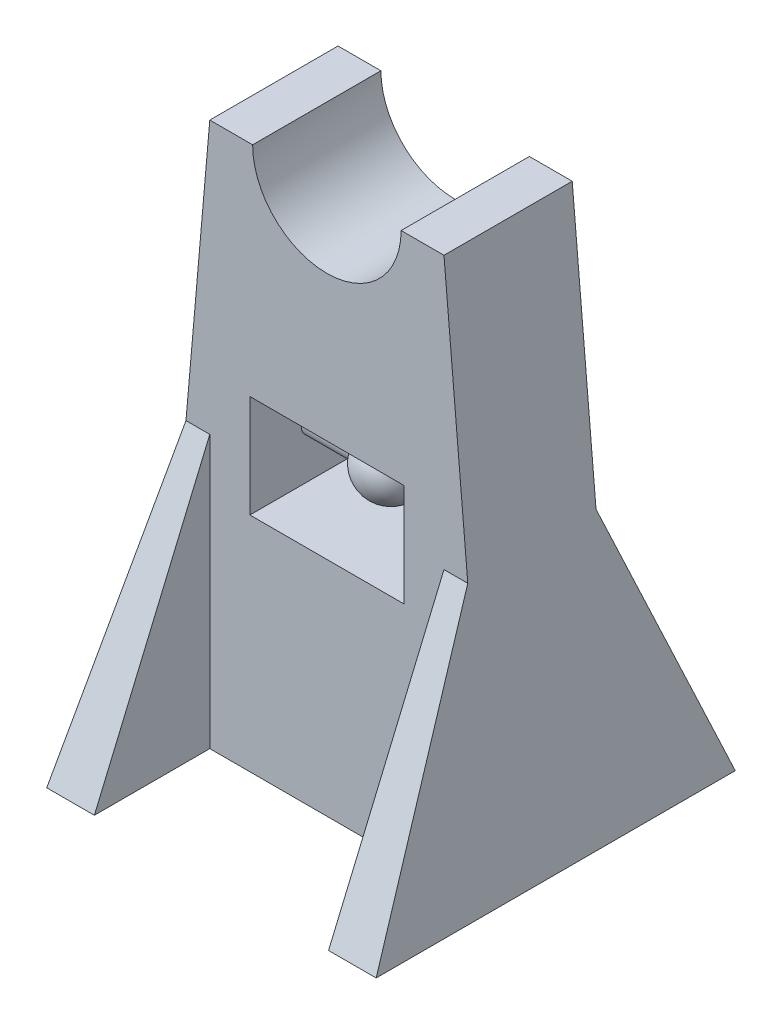
ISO-10303-21;
HEADER;
FILE_DESCRIPTION(('STEP AP214'),'2;1');
FILE_NAME('part.step','',(''),(''),'','','');
FILE_SCHEMA(('AUTOMOTIVE_DESIGN { 1 0 10303 214 1 1 1 1 }'));
ENDSEC;
DATA;
#1=APPLICATION_CONTEXT('core data for automotive mechanical design processes');
#2=APPLICATION_PROTOCOL_DEFINITION('international standard','automotive_design',2000,#1);
#3=PRODUCT_CONTEXT('',#1,'mechanical');
#4=PRODUCT('Part','Part','',(#3));
#5=PRODUCT_RELATED_PRODUCT_CATEGORY('part','',(#4));
#6=PRODUCT_DEFINITION_FORMATION('','',#4);
#7=PRODUCT_DEFINITION_CONTEXT('part definition',#1,'design');
#8=PRODUCT_DEFINITION('design','',#6,#7);
#9=PRODUCT_DEFINITION_SHAPE('','',#8);
#10=(LENGTH_UNIT() NAMED_UNIT(*) SI_UNIT(.MILLI.,.METRE.));
#11=(NAMED_UNIT(*) PLANE_ANGLE_UNIT() SI_UNIT($,.RADIAN.));
#12=(NAMED_UNIT(*) SI_UNIT($,.STERADIAN.) SOLID_ANGLE_UNIT());
#13=UNCERTAINTY_MEASURE_WITH_UNIT(LENGTH_MEASURE(1.E-05),#10,'distance_accuracy_value','');
#14=(GEOMETRIC_REPRESENTATION_CONTEXT(3) GLOBAL_UNCERTAINTY_ASSIGNED_CONTEXT((#13)) GLOBAL_UNIT_ASSIGNED_CONTEXT((#10,
#11,#12)) REPRESENTATION_CONTEXT('',''));
#15=CARTESIAN_POINT('',(0.,0.,0.));
#16=DIRECTION('',(0.,0.,1.));
#17=DIRECTION('',(1.,0.,0.));
#18=AXIS2_PLACEMENT_3D('',#15,#16,#17);
#19=CARTESIAN_POINT('',(30.,-105.527024801528,0.));
#20=DIRECTION('',(-1.,0.,0.));
#21=DIRECTION('',(0.,0.,1.));
#22=AXIS2_PLACEMENT_3D('',#19,#20,#21);
#23=CYLINDRICAL_SURFACE('',#22,5.);
#24=CARTESIAN_POINT('',(-10.9087121146357,-105.527024801528,0.));
#25=DIRECTION('',(1.,0.,0.));
#26=DIRECTION('',(0.,0.,-1.));
#27=AXIS2_PLACEMENT_3D('',#24,#25,#26);
#28=CIRCLE('',#27,5.);
#29=CARTESIAN_POINT('',(-10.9087121146357,-105.527024801528,-5.));
#30=VERTEX_POINT('',#29);
#31=EDGE_CURVE('E12',#30,#30,#28,.T.);
#32=ORIENTED_EDGE('',*,*,#31,.F.);
#33=EDGE_LOOP('',(#32));
#34=FACE_BOUND('',#33,.T.);
#35=CARTESIAN_POINT('',(-30.,-105.527024801528,0.));
#36=DIRECTION('',(-1.,0.,0.));
#37=DIRECTION('',(0.,0.,1.));
#38=AXIS2_PLACEMENT_3D('',#35,#36,#37);
#39=CIRCLE('',#38,5.);
#40=CARTESIAN_POINT('',(-30.,-105.527024801528,5.));
#41=VERTEX_POINT('',#40);
#42=EDGE_CURVE('E388',#41,#41,#39,.T.);
#43=ORIENTED_EDGE('',*,*,#42,.F.);
#44=EDGE_LOOP('',(#43));
#45=FACE_BOUND('',#44,.T.);
#46=ADVANCED_FACE('F47',(#34,#45),#23,.T.);
#47=CARTESIAN_POINT('',(0.,0.,25.));
#48=DIRECTION('',(0.,0.,1.));
#49=DIRECTION('',(1.,0.,0.));
#50=AXIS2_PLACEMENT_3D('',#47,#48,#49);
#51=PLANE('',#50);
#52=DIRECTION('',(1.,0.,0.));
#53=VECTOR('',#52,1.);
#54=CARTESIAN_POINT('',(-30.,-125.527024801528,25.));
#55=LINE('',#54,#53);
#56=CARTESIAN_POINT('',(-30.,-125.527024801528,25.));
#57=VERTEX_POINT('',#56);
#58=CARTESIAN_POINT('',(30.,-125.527024801528,25.));
#59=VERTEX_POINT('',#58);
#60=EDGE_CURVE('E277',#57,#59,#55,.T.);
#61=ORIENTED_EDGE('',*,*,#60,.F.);
#62=DIRECTION('',(0.,-1.,0.));
#63=VECTOR('',#62,1.);
#64=CARTESIAN_POINT('',(-30.,-85.5270248015279,25.));
#65=LINE('',#64,#63);
#66=CARTESIAN_POINT('',(-30.,-85.5270248015279,25.));
#67=VERTEX_POINT('',#66);
#68=EDGE_CURVE('E273',#67,#57,#65,.T.);
#69=ORIENTED_EDGE('',*,*,#68,.F.);
#70=DIRECTION('',(-1.,0.,0.));
#71=VECTOR('',#70,1.);
#72=CARTESIAN_POINT('',(-30.,-85.5270248015279,25.));
#73=LINE('',#72,#71);
#74=CARTESIAN_POINT('',(30.,-85.5270248015279,25.));
#75=VERTEX_POINT('',#74);
#76=EDGE_CURVE('E285',#75,#67,#73,.T.);
#77=ORIENTED_EDGE('',*,*,#76,.F.);
#78=DIRECTION('',(0.,1.,0.));
#79=VECTOR('',#78,1.);
#80=CARTESIAN_POINT('',(30.,-85.5270248015279,25.));
#81=LINE('',#80,#79);
#82=EDGE_CURVE('E281',#59,#75,#81,.T.);
#83=ORIENTED_EDGE('',*,*,#82,.F.);
#84=EDGE_LOOP('',(#61,#69,#77,#83));
#85=FACE_BOUND('',#84,.T.);
#86=DIRECTION('',(0.,1.,0.));
#87=VECTOR('',#86,1.);
#88=CARTESIAN_POINT('',(45.6516342715742,-106.1213,25.));
#89=LINE('',#88,#87);
#90=CARTESIAN_POINT('',(45.6516342715742,-212.2426,25.));
#91=VERTEX_POINT('',#90);
#92=CARTESIAN_POINT('',(45.6516342715742,-106.1213,25.));
#93=VERTEX_POINT('',#92);
#94=EDGE_CURVE('E63',#91,#93,#89,.T.);
#95=ORIENTED_EDGE('',*,*,#94,.T.);
#96=DIRECTION('',(-1.,0.,0.));
#97=VECTOR('',#96,1.);
#98=CARTESIAN_POINT('',(175.0664832077,-106.1213,25.));
#99=LINE('',#98,#97);
#100=CARTESIAN_POINT('',(54.9360449802082,-106.1213,25.));
#101=VERTEX_POINT('',#100);
#102=EDGE_CURVE('E67',#101,#93,#99,.T.);
#103=ORIENTED_EDGE('',*,*,#102,.F.);
#104=DIRECTION('',(-0.0871557427476615,0.996194698091745,0.));
#105=VECTOR('',#104,1.);
#106=CARTESIAN_POINT('',(45.6516342715742,0.,25.));
#107=LINE('',#106,#105);
#108=CARTESIAN_POINT('',(45.6516342715742,0.,25.));
#109=VERTEX_POINT('',#108);
#110=EDGE_CURVE('E198',#101,#109,#107,.T.);
#111=ORIENTED_EDGE('',*,*,#110,.T.);
#112=DIRECTION('',(-1.,0.,0.));
#113=VECTOR('',#112,1.);
#114=CARTESIAN_POINT('',(28.9435,0.,25.));
#115=LINE('',#114,#113);
#116=CARTESIAN_POINT('',(28.9435,0.,25.));
#117=VERTEX_POINT('',#116);
#118=EDGE_CURVE('E305',#109,#117,#115,.T.);
#119=ORIENTED_EDGE('',*,*,#118,.T.);
#120=CARTESIAN_POINT('',(0.,0.,25.));
#121=DIRECTION('',(0.,0.,-1.));
#122=DIRECTION('',(1.,0.,0.));
#123=AXIS2_PLACEMENT_3D('',#120,#121,#122);
#124=CIRCLE('',#123,28.9435);
#125=CARTESIAN_POINT('',(-28.9435,0.,25.));
#126=VERTEX_POINT('',#125);
#127=EDGE_CURVE('E289',#117,#126,#124,.T.);
#128=ORIENTED_EDGE('',*,*,#127,.T.);
#129=DIRECTION('',(-1.,0.,0.));
#130=VECTOR('',#129,1.);
#131=CARTESIAN_POINT('',(-28.9435,0.,25.));
#132=LINE('',#131,#130);
#133=CARTESIAN_POINT('',(-45.6516342715742,0.,25.));
#134=VERTEX_POINT('',#133);
#135=EDGE_CURVE('E293',#126,#134,#132,.T.);
#136=ORIENTED_EDGE('',*,*,#135,.T.);
#137=DIRECTION('',(-0.0871557427476615,-0.996194698091745,0.));
#138=VECTOR('',#137,1.);
#139=CARTESIAN_POINT('',(-45.6516342715742,0.,25.));
#140=LINE('',#139,#138);
#141=CARTESIAN_POINT('',(-54.9360449802082,-106.1213,25.));
#142=VERTEX_POINT('',#141);
#143=EDGE_CURVE('E297',#134,#142,#140,.T.);
#144=ORIENTED_EDGE('',*,*,#143,.T.);
#145=DIRECTION('',(1.,0.,0.));
#146=VECTOR('',#145,1.);
#147=CARTESIAN_POINT('',(-175.0664832077,-106.1213,25.));
#148=LINE('',#147,#146);
#149=CARTESIAN_POINT('',(-45.6516342715742,-106.1213,25.));
#150=VERTEX_POINT('',#149);
#151=EDGE_CURVE('E247',#142,#150,#148,.T.);
#152=ORIENTED_EDGE('',*,*,#151,.T.);
#153=DIRECTION('',(0.,1.,0.));
#154=VECTOR('',#153,1.);
#155=CARTESIAN_POINT('',(-45.6516342715742,-106.1213,25.));
#156=LINE('',#155,#154);
#157=CARTESIAN_POINT('',(-45.6516342715742,-212.2426,25.));
#158=VERTEX_POINT('',#157);
#159=EDGE_CURVE('E225',#158,#150,#156,.T.);
#160=ORIENTED_EDGE('',*,*,#159,.F.);
#161=DIRECTION('',(1.,0.,0.));
#162=VECTOR('',#161,1.);
#163=CARTESIAN_POINT('',(-64.2204556888422,-212.2426,25.));
#164=LINE('',#163,#162);
#165=EDGE_CURVE('E300',#158,#91,#164,.T.);
#166=ORIENTED_EDGE('',*,*,#165,.T.);
#167=EDGE_LOOP('',(#95,#103,#111,#119,#128,#136,#144,#152,#160,#166));
#168=FACE_BOUND('',#167,.T.);
#169=ADVANCED_FACE('F401',(#85,#168),#51,.T.);
#170=CARTESIAN_POINT('',(0.,0.,-25.));
#171=DIRECTION('',(0.,0.,1.));
#172=DIRECTION('',(1.,0.,0.));
#173=AXIS2_PLACEMENT_3D('',#170,#171,#172);
#174=PLANE('',#173);
#175=DIRECTION('',(-1.,0.,0.));
#176=VECTOR('',#175,1.);
#177=CARTESIAN_POINT('',(-30.,-85.5270248015279,-25.));
#178=LINE('',#177,#176);
#179=CARTESIAN_POINT('',(30.,-85.5270248015279,-25.));
#180=VERTEX_POINT('',#179);
#181=CARTESIAN_POINT('',(-30.,-85.5270248015279,-25.));
#182=VERTEX_POINT('',#181);
#183=EDGE_CURVE('E321',#180,#182,#178,.T.);
#184=ORIENTED_EDGE('',*,*,#183,.T.);
#185=DIRECTION('',(0.,-1.,0.));
#186=VECTOR('',#185,1.);
#187=CARTESIAN_POINT('',(-30.,-85.5270248015279,-25.));
#188=LINE('',#187,#186);
#189=CARTESIAN_POINT('',(-30.,-125.527024801528,-25.));
#190=VERTEX_POINT('',#189);
#191=EDGE_CURVE('E309',#182,#190,#188,.T.);
#192=ORIENTED_EDGE('',*,*,#191,.T.);
#193=DIRECTION('',(1.,0.,0.));
#194=VECTOR('',#193,1.);
#195=CARTESIAN_POINT('',(-30.,-125.527024801528,-25.));
#196=LINE('',#195,#194);
#197=CARTESIAN_POINT('',(30.,-125.527024801528,-25.));
#198=VERTEX_POINT('',#197);
#199=EDGE_CURVE('E313',#190,#198,#196,.T.);
#200=ORIENTED_EDGE('',*,*,#199,.T.);
#201=DIRECTION('',(0.,1.,0.));
#202=VECTOR('',#201,1.);
#203=CARTESIAN_POINT('',(30.,-85.5270248015279,-25.));
#204=LINE('',#203,#202);
#205=EDGE_CURVE('E317',#198,#180,#204,.T.);
#206=ORIENTED_EDGE('',*,*,#205,.T.);
#207=EDGE_LOOP('',(#184,#192,#200,#206));
#208=FACE_BOUND('',#207,.T.);
#209=DIRECTION('',(-1.,0.,0.));
#210=VECTOR('',#209,1.);
#211=CARTESIAN_POINT('',(175.0664832077,-106.1213,-25.));
#212=LINE('',#211,#210);
#213=CARTESIAN_POINT('',(54.9360449802082,-106.1213,-25.));
#214=VERTEX_POINT('',#213);
#215=CARTESIAN_POINT('',(45.6516342715742,-106.1213,-25.));
#216=VERTEX_POINT('',#215);
#217=EDGE_CURVE('E219',#214,#216,#212,.T.);
#218=ORIENTED_EDGE('',*,*,#217,.T.);
#219=DIRECTION('',(0.,-1.,0.));
#220=VECTOR('',#219,1.);
#221=CARTESIAN_POINT('',(45.6516342715742,-106.1213,-25.));
#222=LINE('',#221,#220);
#223=CARTESIAN_POINT('',(45.6516342715742,-212.2426,-25.));
#224=VERTEX_POINT('',#223);
#225=EDGE_CURVE('E215',#216,#224,#222,.T.);
#226=ORIENTED_EDGE('',*,*,#225,.T.);
#227=DIRECTION('',(1.,0.,0.));
#228=VECTOR('',#227,1.);
#229=CARTESIAN_POINT('',(-64.2204556888422,-212.2426,-25.));
#230=LINE('',#229,#228);
#231=CARTESIAN_POINT('',(-45.6516342715742,-212.2426,-25.));
#232=VERTEX_POINT('',#231);
#233=EDGE_CURVE('E349',#232,#224,#230,.T.);
#234=ORIENTED_EDGE('',*,*,#233,.F.);
#235=DIRECTION('',(0.,-1.,0.));
#236=VECTOR('',#235,1.);
#237=CARTESIAN_POINT('',(-45.6516342715742,-106.1213,-25.));
#238=LINE('',#237,#236);
#239=CARTESIAN_POINT('',(-45.6516342715742,-106.1213,-25.));
#240=VERTEX_POINT('',#239);
#241=EDGE_CURVE('E256',#240,#232,#238,.T.);
#242=ORIENTED_EDGE('',*,*,#241,.F.);
#243=DIRECTION('',(1.,0.,0.));
#244=VECTOR('',#243,1.);
#245=CARTESIAN_POINT('',(-175.0664832077,-106.1213,-25.));
#246=LINE('',#245,#244);
#247=CARTESIAN_POINT('',(-54.9360449802082,-106.1213,-25.));
#248=VERTEX_POINT('',#247);
#249=EDGE_CURVE('E267',#248,#240,#246,.T.);
#250=ORIENTED_EDGE('',*,*,#249,.F.);
#251=DIRECTION('',(-0.0871557427476615,-0.996194698091745,0.));
#252=VECTOR('',#251,1.);
#253=CARTESIAN_POINT('',(-45.6516342715742,0.,-25.));
#254=LINE('',#253,#252);
#255=CARTESIAN_POINT('',(-45.6516342715742,0.,-25.));
#256=VERTEX_POINT('',#255);
#257=EDGE_CURVE('E345',#256,#248,#254,.T.);
#258=ORIENTED_EDGE('',*,*,#257,.F.);
#259=DIRECTION('',(-1.,0.,0.));
#260=VECTOR('',#259,1.);
#261=CARTESIAN_POINT('',(-28.9435,0.,-25.));
#262=LINE('',#261,#260);
#263=CARTESIAN_POINT('',(-28.9435,0.,-25.));
#264=VERTEX_POINT('',#263);
#265=EDGE_CURVE('E341',#264,#256,#262,.T.);
#266=ORIENTED_EDGE('',*,*,#265,.F.);
#267=CARTESIAN_POINT('',(0.,0.,-25.));
#268=DIRECTION('',(0.,0.,-1.));
#269=DIRECTION('',(1.,0.,0.));
#270=AXIS2_PLACEMENT_3D('',#267,#268,#269);
#271=CIRCLE('',#270,28.9435);
#272=CARTESIAN_POINT('',(28.9435,0.,-25.));
#273=VERTEX_POINT('',#272);
#274=EDGE_CURVE('E329',#273,#264,#271,.T.);
#275=ORIENTED_EDGE('',*,*,#274,.F.);
#276=DIRECTION('',(-1.,0.,0.));
#277=VECTOR('',#276,1.);
#278=CARTESIAN_POINT('',(28.9435,0.,-25.));
#279=LINE('',#278,#277);
#280=CARTESIAN_POINT('',(45.6516342715742,0.,-25.));
#281=VERTEX_POINT('',#280);
#282=EDGE_CURVE('E356',#281,#273,#279,.T.);
#283=ORIENTED_EDGE('',*,*,#282,.F.);
#284=DIRECTION('',(-0.0871557427476615,0.996194698091745,0.));
#285=VECTOR('',#284,1.);
#286=CARTESIAN_POINT('',(45.6516342715742,0.,-25.));
#287=LINE('',#286,#285);
#288=EDGE_CURVE('E353',#214,#281,#287,.T.);
#289=ORIENTED_EDGE('',*,*,#288,.F.);
#290=EDGE_LOOP('',(#218,#226,#234,#242,#250,#258,#266,#275,#283,#289));
#291=FACE_BOUND('',#290,.T.);
#292=ADVANCED_FACE('F406',(#208,#291),#174,.F.);
#293=CARTESIAN_POINT('',(0.,0.,-25.));
#294=DIRECTION('',(0.,0.,1.));
#295=DIRECTION('',(1.,0.,0.));
#296=AXIS2_PLACEMENT_3D('',#293,#294,#295);
#297=CYLINDRICAL_SURFACE('',#296,28.9435);
#298=DIRECTION('',(0.,0.,1.));
#299=VECTOR('',#298,1.);
#300=CARTESIAN_POINT('',(-28.9435,0.,-25.));
#301=LINE('',#300,#299);
#302=EDGE_CURVE('E360',#264,#126,#301,.T.);
#303=ORIENTED_EDGE('',*,*,#302,.T.);
#304=ORIENTED_EDGE('',*,*,#127,.F.);
#305=DIRECTION('',(0.,0.,1.));
#306=VECTOR('',#305,1.);
#307=CARTESIAN_POINT('',(28.9435,0.,-25.));
#308=LINE('',#307,#306);
#309=EDGE_CURVE('E361',#273,#117,#308,.T.);
#310=ORIENTED_EDGE('',*,*,#309,.F.);
#311=ORIENTED_EDGE('',*,*,#274,.T.);
#312=EDGE_LOOP('',(#303,#304,#310,#311));
#313=FACE_BOUND('',#312,.T.);
#314=ADVANCED_FACE('F49',(#313),#297,.F.);
#315=CARTESIAN_POINT('',(28.9435,0.,-25.));
#316=DIRECTION('',(0.,1.,0.));
#317=DIRECTION('',(0.,0.,1.));
#318=AXIS2_PLACEMENT_3D('',#315,#316,#317);
#319=PLANE('',#318);
#320=ORIENTED_EDGE('',*,*,#309,.T.);
#321=ORIENTED_EDGE('',*,*,#118,.F.);
#322=DIRECTION('',(0.,0.,1.));
#323=VECTOR('',#322,1.);
#324=CARTESIAN_POINT('',(45.6516342715742,0.,-25.));
#325=LINE('',#324,#323);
#326=EDGE_CURVE('E183',#281,#109,#325,.T.);
#327=ORIENTED_EDGE('',*,*,#326,.F.);
#328=ORIENTED_EDGE('',*,*,#282,.T.);
#329=EDGE_LOOP('',(#320,#321,#327,#328));
#330=FACE_BOUND('',#329,.T.);
#331=ADVANCED_FACE('F458',(#330),#319,.T.);
#332=CARTESIAN_POINT('',(45.6516342715742,0.,-25.));
#333=DIRECTION('',(0.996194698091745,0.0871557427476615,0.));
#334=DIRECTION('',(-0.0871557427476615,0.996194698091745,0.));
#335=AXIS2_PLACEMENT_3D('',#332,#333,#334);
#336=PLANE('',#335);
#337=ORIENTED_EDGE('',*,*,#326,.T.);
#338=ORIENTED_EDGE('',*,*,#110,.F.);
#339=DIRECTION('',(0.0802862269043633,-0.917675772708202,0.389134035974579));
#340=VECTOR('',#339,1.);
#341=CARTESIAN_POINT('',(64.9349556845677,-220.409372321465,73.4630630652464));
#342=LINE('',#341,#340);
#343=CARTESIAN_POINT('',(64.2204556888422,-212.2426,70.));
#344=VERTEX_POINT('',#343);
#345=EDGE_CURVE('E189',#101,#344,#342,.T.);
#346=ORIENTED_EDGE('',*,*,#345,.T.);
#347=DIRECTION('',(0.,0.,1.));
#348=VECTOR('',#347,1.);
#349=CARTESIAN_POINT('',(64.2204556888422,-212.2426,-25.));
#350=LINE('',#349,#348);
#351=CARTESIAN_POINT('',(64.2204556888422,-212.2426,-70.));
#352=VERTEX_POINT('',#351);
#353=EDGE_CURVE('E170',#352,#344,#350,.T.);
#354=ORIENTED_EDGE('',*,*,#353,.F.);
#355=DIRECTION('',(-0.0802862269043633,0.917675772708202,0.389134035974579));
#356=VECTOR('',#355,1.);
#357=CARTESIAN_POINT('',(64.9349556845677,-220.409372321465,-73.4630630652464));
#358=LINE('',#357,#356);
#359=EDGE_CURVE('E214',#352,#214,#358,.T.);
#360=ORIENTED_EDGE('',*,*,#359,.T.);
#361=ORIENTED_EDGE('',*,*,#288,.T.);
#362=EDGE_LOOP('',(#337,#338,#346,#354,#360,#361));
#363=FACE_BOUND('',#362,.T.);
#364=ADVANCED_FACE('F197',(#363),#336,.T.);
#365=CARTESIAN_POINT('',(-64.2204556888422,-212.2426,-25.));
#366=DIRECTION('',(0.,-1.,0.));
#367=DIRECTION('',(0.,0.,-1.));
#368=AXIS2_PLACEMENT_3D('',#365,#366,#367);
#369=PLANE('',#368);
#370=ORIENTED_EDGE('',*,*,#353,.T.);
#371=DIRECTION('',(-1.,0.,0.));
#372=VECTOR('',#371,1.);
#373=CARTESIAN_POINT('',(175.0664832077,-212.2426,70.));
#374=LINE('',#373,#372);
#375=CARTESIAN_POINT('',(45.6516342715742,-212.2426,70.));
#376=VERTEX_POINT('',#375);
#377=EDGE_CURVE('E174',#344,#376,#374,.T.);
#378=ORIENTED_EDGE('',*,*,#377,.T.);
#379=DIRECTION('',(0.,0.,-1.));
#380=VECTOR('',#379,1.);
#381=CARTESIAN_POINT('',(45.6516342715742,-212.2426,25.));
#382=LINE('',#381,#380);
#383=EDGE_CURVE('E194',#376,#91,#382,.T.);
#384=ORIENTED_EDGE('',*,*,#383,.T.);
#385=ORIENTED_EDGE('',*,*,#165,.F.);
#386=DIRECTION('',(0.,0.,-1.));
#387=VECTOR('',#386,1.);
#388=CARTESIAN_POINT('',(-45.6516342715742,-212.2426,25.));
#389=LINE('',#388,#387);
#390=CARTESIAN_POINT('',(-45.6516342715742,-212.2426,70.));
#391=VERTEX_POINT('',#390);
#392=EDGE_CURVE('E229',#391,#158,#389,.T.);
#393=ORIENTED_EDGE('',*,*,#392,.F.);
#394=DIRECTION('',(1.,0.,0.));
#395=VECTOR('',#394,1.);
#396=CARTESIAN_POINT('',(-175.0664832077,-212.2426,70.));
#397=LINE('',#396,#395);
#398=CARTESIAN_POINT('',(-64.2204556888422,-212.2426,70.));
#399=VERTEX_POINT('',#398);
#400=EDGE_CURVE('E244',#399,#391,#397,.T.);
#401=ORIENTED_EDGE('',*,*,#400,.F.);
#402=DIRECTION('',(0.,0.,1.));
#403=VECTOR('',#402,1.);
#404=CARTESIAN_POINT('',(-64.2204556888422,-212.2426,-25.));
#405=LINE('',#404,#403);
#406=CARTESIAN_POINT('',(-64.2204556888422,-212.2426,-70.));
#407=VERTEX_POINT('',#406);
#408=EDGE_CURVE('E184',#407,#399,#405,.T.);
#409=ORIENTED_EDGE('',*,*,#408,.F.);
#410=DIRECTION('',(1.,0.,0.));
#411=VECTOR('',#410,1.);
#412=CARTESIAN_POINT('',(-175.0664832077,-212.2426,-70.));
#413=LINE('',#412,#411);
#414=CARTESIAN_POINT('',(-45.6516342715742,-212.2426,-70.));
#415=VERTEX_POINT('',#414);
#416=EDGE_CURVE('E255',#407,#415,#413,.T.);
#417=ORIENTED_EDGE('',*,*,#416,.T.);
#418=DIRECTION('',(0.,0.,-1.));
#419=VECTOR('',#418,1.);
#420=CARTESIAN_POINT('',(-45.6516342715742,-212.2426,-25.));
#421=LINE('',#420,#419);
#422=EDGE_CURVE('E251',#232,#415,#421,.T.);
#423=ORIENTED_EDGE('',*,*,#422,.F.);
#424=ORIENTED_EDGE('',*,*,#233,.T.);
#425=DIRECTION('',(0.,0.,-1.));
#426=VECTOR('',#425,1.);
#427=CARTESIAN_POINT('',(45.6516342715742,-212.2426,-25.));
#428=LINE('',#427,#426);
#429=CARTESIAN_POINT('',(45.6516342715742,-212.2426,-70.));
#430=VERTEX_POINT('',#429);
#431=EDGE_CURVE('E211',#224,#430,#428,.T.);
#432=ORIENTED_EDGE('',*,*,#431,.T.);
#433=DIRECTION('',(-1.,0.,0.));
#434=VECTOR('',#433,1.);
#435=CARTESIAN_POINT('',(175.0664832077,-212.2426,-70.));
#436=LINE('',#435,#434);
#437=EDGE_CURVE('E177',#352,#430,#436,.T.);
#438=ORIENTED_EDGE('',*,*,#437,.F.);
#439=EDGE_LOOP('',(#370,#378,#384,#385,#393,#401,#409,#417,#423,#424,#432,#438));
#440=FACE_BOUND('',#439,.T.);
#441=ADVANCED_FACE('F172',(#440),#369,.T.);
#442=CARTESIAN_POINT('',(-45.6516342715742,0.,-25.));
#443=DIRECTION('',(-0.996194698091745,0.0871557427476615,0.));
#444=DIRECTION('',(-0.0871557427476615,-0.996194698091745,0.));
#445=AXIS2_PLACEMENT_3D('',#442,#443,#444);
#446=PLANE('',#445);
#447=ORIENTED_EDGE('',*,*,#408,.T.);
#448=DIRECTION('',(-0.0802862269043633,-0.917675772708202,0.389134035974579));
#449=VECTOR('',#448,1.);
#450=CARTESIAN_POINT('',(-64.9349556845677,-220.409372321465,73.4630630652464));
#451=LINE('',#450,#449);
#452=EDGE_CURVE('E233',#142,#399,#451,.T.);
#453=ORIENTED_EDGE('',*,*,#452,.F.);
#454=ORIENTED_EDGE('',*,*,#143,.F.);
#455=DIRECTION('',(0.,0.,1.));
#456=VECTOR('',#455,1.);
#457=CARTESIAN_POINT('',(-45.6516342715742,0.,-25.));
#458=LINE('',#457,#456);
#459=EDGE_CURVE('E368',#256,#134,#458,.T.);
#460=ORIENTED_EDGE('',*,*,#459,.F.);
#461=ORIENTED_EDGE('',*,*,#257,.T.);
#462=DIRECTION('',(0.0802862269043633,0.917675772708202,0.389134035974579));
#463=VECTOR('',#462,1.);
#464=CARTESIAN_POINT('',(-64.9349556845677,-220.409372321465,-73.4630630652464));
#465=LINE('',#464,#463);
#466=EDGE_CURVE('E263',#407,#248,#465,.T.);
#467=ORIENTED_EDGE('',*,*,#466,.F.);
#468=EDGE_LOOP('',(#447,#453,#454,#460,#461,#467));
#469=FACE_BOUND('',#468,.T.);
#470=ADVANCED_FACE('F466',(#469),#446,.T.);
#471=CARTESIAN_POINT('',(-28.9435,0.,-25.));
#472=DIRECTION('',(0.,1.,0.));
#473=DIRECTION('',(0.,0.,1.));
#474=AXIS2_PLACEMENT_3D('',#471,#472,#473);
#475=PLANE('',#474);
#476=ORIENTED_EDGE('',*,*,#459,.T.);
#477=ORIENTED_EDGE('',*,*,#135,.F.);
#478=ORIENTED_EDGE('',*,*,#302,.F.);
#479=ORIENTED_EDGE('',*,*,#265,.T.);
#480=EDGE_LOOP('',(#476,#477,#478,#479));
#481=FACE_BOUND('',#480,.T.);
#482=ADVANCED_FACE('F454',(#481),#475,.T.);
#483=CARTESIAN_POINT('',(-30.,-85.5270248015279,-25.));
#484=DIRECTION('',(-1.,0.,0.));
#485=DIRECTION('',(0.,-1.,0.));
#486=AXIS2_PLACEMENT_3D('',#483,#484,#485);
#487=PLANE('',#486);
#488=ORIENTED_EDGE('',*,*,#42,.T.);
#489=EDGE_LOOP('',(#488));
#490=FACE_BOUND('',#489,.T.);
#491=DIRECTION('',(0.,0.,1.));
#492=VECTOR('',#491,1.);
#493=CARTESIAN_POINT('',(-30.,-85.5270248015279,-25.));
#494=LINE('',#493,#492);
#495=EDGE_CURVE('E326',#182,#67,#494,.T.);
#496=ORIENTED_EDGE('',*,*,#495,.T.);
#497=ORIENTED_EDGE('',*,*,#68,.T.);
#498=DIRECTION('',(0.,0.,1.));
#499=VECTOR('',#498,1.);
#500=CARTESIAN_POINT('',(-30.,-125.527024801528,-25.));
#501=LINE('',#500,#499);
#502=EDGE_CURVE('E325',#190,#57,#501,.T.);
#503=ORIENTED_EDGE('',*,*,#502,.F.);
#504=ORIENTED_EDGE('',*,*,#191,.F.);
#505=EDGE_LOOP('',(#496,#497,#503,#504));
#506=FACE_BOUND('',#505,.T.);
#507=ADVANCED_FACE('F397',(#490,#506),#487,.F.);
#508=CARTESIAN_POINT('',(-30.,-85.5270248015279,-25.));
#509=DIRECTION('',(0.,1.,0.));
#510=DIRECTION('',(0.,0.,1.));
#511=AXIS2_PLACEMENT_3D('',#508,#509,#510);
#512=PLANE('',#511);
#513=DIRECTION('',(0.,0.,1.));
#514=VECTOR('',#513,1.);
#515=CARTESIAN_POINT('',(30.,-85.5270248015279,-25.));
#516=LINE('',#515,#514);
#517=EDGE_CURVE('E330',#180,#75,#516,.T.);
#518=ORIENTED_EDGE('',*,*,#517,.T.);
#519=ORIENTED_EDGE('',*,*,#76,.T.);
#520=ORIENTED_EDGE('',*,*,#495,.F.);
#521=ORIENTED_EDGE('',*,*,#183,.F.);
#522=EDGE_LOOP('',(#518,#519,#520,#521));
#523=FACE_BOUND('',#522,.T.);
#524=ADVANCED_FACE('F442',(#523),#512,.F.);
#525=CARTESIAN_POINT('',(30.,-85.5270248015279,-25.));
#526=DIRECTION('',(1.,0.,0.));
#527=DIRECTION('',(0.,1.,0.));
#528=AXIS2_PLACEMENT_3D('',#525,#526,#527);
#529=PLANE('',#528);
#530=CARTESIAN_POINT('',(30.,-105.527024801528,0.));
#531=DIRECTION('',(-1.,0.,0.));
#532=DIRECTION('',(0.,0.,1.));
#533=AXIS2_PLACEMENT_3D('',#530,#531,#532);
#534=CIRCLE('',#533,5.);
#535=CARTESIAN_POINT('',(30.,-105.527024801528,5.));
#536=VERTEX_POINT('',#535);
#537=EDGE_CURVE('E385',#536,#536,#534,.T.);
#538=ORIENTED_EDGE('',*,*,#537,.F.);
#539=EDGE_LOOP('',(#538));
#540=FACE_BOUND('',#539,.T.);
#541=DIRECTION('',(0.,0.,1.));
#542=VECTOR('',#541,1.);
#543=CARTESIAN_POINT('',(30.,-125.527024801528,-25.));
#544=LINE('',#543,#542);
#545=EDGE_CURVE('E333',#198,#59,#544,.T.);
#546=ORIENTED_EDGE('',*,*,#545,.T.);
#547=ORIENTED_EDGE('',*,*,#82,.T.);
#548=ORIENTED_EDGE('',*,*,#517,.F.);
#549=ORIENTED_EDGE('',*,*,#205,.F.);
#550=EDGE_LOOP('',(#546,#547,#548,#549));
#551=FACE_BOUND('',#550,.T.);
#552=ADVANCED_FACE('F445',(#540,#551),#529,.F.);
#553=CARTESIAN_POINT('',(-30.,-125.527024801528,-25.));
#554=DIRECTION('',(0.,-1.,0.));
#555=DIRECTION('',(0.,0.,-1.));
#556=AXIS2_PLACEMENT_3D('',#553,#554,#555);
#557=PLANE('',#556);
#558=ORIENTED_EDGE('',*,*,#502,.T.);
#559=ORIENTED_EDGE('',*,*,#60,.T.);
#560=ORIENTED_EDGE('',*,*,#545,.F.);
#561=ORIENTED_EDGE('',*,*,#199,.F.);
#562=EDGE_LOOP('',(#558,#559,#560,#561));
#563=FACE_BOUND('',#562,.T.);
#564=ADVANCED_FACE('F437',(#563),#557,.F.);
#565=CARTESIAN_POINT('',(-45.6516342715742,0.,0.));
#566=DIRECTION('',(-1.,0.,0.));
#567=DIRECTION('',(0.,0.,1.));
#568=AXIS2_PLACEMENT_3D('',#565,#566,#567);
#569=PLANE('',#568);
#570=DIRECTION('',(0.,0.920647761401851,0.390394287132586));
#571=VECTOR('',#570,1.);
#572=CARTESIAN_POINT('',(-45.6516342715742,-212.2426,-70.));
#573=LINE('',#572,#571);
#574=EDGE_CURVE('E250',#415,#240,#573,.T.);
#575=ORIENTED_EDGE('',*,*,#574,.T.);
#576=ORIENTED_EDGE('',*,*,#241,.T.);
#577=ORIENTED_EDGE('',*,*,#422,.T.);
#578=EDGE_LOOP('',(#575,#576,#577));
#579=FACE_BOUND('',#578,.T.);
#580=ADVANCED_FACE('F434',(#579),#569,.F.);
#581=CARTESIAN_POINT('',(-175.0664832077,-212.2426,-70.));
#582=DIRECTION('',(0.,0.390394287132586,-0.920647761401851));
#583=DIRECTION('',(0.,0.920647761401851,0.390394287132586));
#584=AXIS2_PLACEMENT_3D('',#581,#582,#583);
#585=PLANE('',#584);
#586=ORIENTED_EDGE('',*,*,#416,.F.);
#587=ORIENTED_EDGE('',*,*,#466,.T.);
#588=ORIENTED_EDGE('',*,*,#249,.T.);
#589=ORIENTED_EDGE('',*,*,#574,.F.);
#590=EDGE_LOOP('',(#586,#587,#588,#589));
#591=FACE_BOUND('',#590,.T.);
#592=ADVANCED_FACE('F429',(#591),#585,.T.);
#593=CARTESIAN_POINT('',(-45.6516342715742,0.,0.));
#594=DIRECTION('',(-1.,0.,0.));
#595=DIRECTION('',(0.,0.,1.));
#596=AXIS2_PLACEMENT_3D('',#593,#594,#595);
#597=PLANE('',#596);
#598=ORIENTED_EDGE('',*,*,#159,.T.);
#599=DIRECTION('',(0.,-0.920647761401851,0.390394287132586));
#600=VECTOR('',#599,1.);
#601=CARTESIAN_POINT('',(-45.6516342715742,-212.2426,70.));
#602=LINE('',#601,#600);
#603=EDGE_CURVE('E234',#150,#391,#602,.T.);
#604=ORIENTED_EDGE('',*,*,#603,.T.);
#605=ORIENTED_EDGE('',*,*,#392,.T.);
#606=EDGE_LOOP('',(#598,#604,#605));
#607=FACE_BOUND('',#606,.T.);
#608=ADVANCED_FACE('F426',(#607),#597,.F.);
#609=CARTESIAN_POINT('',(-175.0664832077,-212.2426,70.));
#610=DIRECTION('',(0.,0.390394287132586,0.920647761401851));
#611=DIRECTION('',(0.,-0.920647761401851,0.390394287132586));
#612=AXIS2_PLACEMENT_3D('',#609,#610,#611);
#613=PLANE('',#612);
#614=ORIENTED_EDGE('',*,*,#151,.F.);
#615=ORIENTED_EDGE('',*,*,#452,.T.);
#616=ORIENTED_EDGE('',*,*,#400,.T.);
#617=ORIENTED_EDGE('',*,*,#603,.F.);
#618=EDGE_LOOP('',(#614,#615,#616,#617));
#619=FACE_BOUND('',#618,.T.);
#620=ADVANCED_FACE('F424',(#619),#613,.T.);
#621=CARTESIAN_POINT('',(175.0664832077,-212.2426,-70.));
#622=DIRECTION('',(0.,-0.390394287132586,0.920647761401851));
#623=DIRECTION('',(0.,-0.920647761401851,-0.390394287132586));
#624=AXIS2_PLACEMENT_3D('',#621,#622,#623);
#625=PLANE('',#624);
#626=ORIENTED_EDGE('',*,*,#359,.F.);
#627=ORIENTED_EDGE('',*,*,#437,.T.);
#628=DIRECTION('',(0.,0.920647761401851,0.390394287132586));
#629=VECTOR('',#628,1.);
#630=CARTESIAN_POINT('',(45.6516342715742,-212.2426,-70.));
#631=LINE('',#630,#629);
#632=EDGE_CURVE('E203',#430,#216,#631,.T.);
#633=ORIENTED_EDGE('',*,*,#632,.T.);
#634=ORIENTED_EDGE('',*,*,#217,.F.);
#635=EDGE_LOOP('',(#626,#627,#633,#634));
#636=FACE_BOUND('',#635,.T.);
#637=ADVANCED_FACE('F420',(#636),#625,.F.);
#638=CARTESIAN_POINT('',(45.6516342715742,0.,0.));
#639=DIRECTION('',(-1.,0.,0.));
#640=DIRECTION('',(0.,0.,1.));
#641=AXIS2_PLACEMENT_3D('',#638,#639,#640);
#642=PLANE('',#641);
#643=ORIENTED_EDGE('',*,*,#632,.F.);
#644=ORIENTED_EDGE('',*,*,#431,.F.);
#645=ORIENTED_EDGE('',*,*,#225,.F.);
#646=EDGE_LOOP('',(#643,#644,#645));
#647=FACE_BOUND('',#646,.T.);
#648=ADVANCED_FACE('F417',(#647),#642,.T.);
#649=CARTESIAN_POINT('',(175.0664832077,-212.2426,70.));
#650=DIRECTION('',(0.,-0.390394287132586,-0.920647761401851));
#651=DIRECTION('',(0.,0.920647761401851,-0.390394287132586));
#652=AXIS2_PLACEMENT_3D('',#649,#650,#651);
#653=PLANE('',#652);
#654=ORIENTED_EDGE('',*,*,#345,.F.);
#655=ORIENTED_EDGE('',*,*,#102,.T.);
#656=DIRECTION('',(0.,-0.920647761401851,0.390394287132586));
#657=VECTOR('',#656,1.);
#658=CARTESIAN_POINT('',(45.6516342715742,-212.2426,70.));
#659=LINE('',#658,#657);
#660=EDGE_CURVE('E191',#93,#376,#659,.T.);
#661=ORIENTED_EDGE('',*,*,#660,.T.);
#662=ORIENTED_EDGE('',*,*,#377,.F.);
#663=EDGE_LOOP('',(#654,#655,#661,#662));
#664=FACE_BOUND('',#663,.T.);
#665=ADVANCED_FACE('F188',(#664),#653,.F.);
#666=CARTESIAN_POINT('',(45.6516342715742,0.,0.));
#667=DIRECTION('',(-1.,0.,0.));
#668=DIRECTION('',(0.,0.,1.));
#669=AXIS2_PLACEMENT_3D('',#666,#667,#668);
#670=PLANE('',#669);
#671=ORIENTED_EDGE('',*,*,#94,.F.);
#672=ORIENTED_EDGE('',*,*,#383,.F.);
#673=ORIENTED_EDGE('',*,*,#660,.F.);
#674=EDGE_LOOP('',(#671,#672,#673));
#675=FACE_BOUND('',#674,.T.);
#676=ADVANCED_FACE('F381',(#675),#670,.T.);
#677=CARTESIAN_POINT('',(10.9087121146357,-105.527024801528,0.));
#678=DIRECTION('',(-1.,0.,0.));
#679=DIRECTION('',(0.,0.,1.));
#680=AXIS2_PLACEMENT_3D('',#677,#678,#679);
#681=CIRCLE('',#680,5.);
#682=CARTESIAN_POINT('',(10.9087121146357,-105.527024801528,5.));
#683=VERTEX_POINT('',#682);
#684=EDGE_CURVE('E56',#683,#683,#681,.T.);
#685=ORIENTED_EDGE('',*,*,#684,.F.);
#686=EDGE_LOOP('',(#685));
#687=FACE_BOUND('',#686,.T.);
#688=ORIENTED_EDGE('',*,*,#537,.T.);
#689=EDGE_LOOP('',(#688));
#690=FACE_BOUND('',#689,.T.);
#691=ADVANCED_FACE('F378',(#687,#690),#23,.T.);
#692=CARTESIAN_POINT('',(0.,-105.527024801528,0.));
#693=DIRECTION('',(0.,1.,0.));
#694=DIRECTION('',(1.,0.,0.));
#695=AXIS2_PLACEMENT_3D('',#692,#693,#694);
#696=SPHERICAL_SURFACE('',#695,12.);
#697=CARTESIAN_POINT('',(0.,-105.527024801528,0.));
#698=DIRECTION('',(1.,0.,0.));
#699=DIRECTION('',(0.,0.,-1.));
#700=AXIS2_PLACEMENT_3D('',#697,#698,#699);
#701=SPHERICAL_SURFACE('',#700,12.);
#702=ORIENTED_EDGE('',*,*,#31,.T.);
#703=EDGE_LOOP('',(#702));
#704=FACE_BOUND('',#703,.T.);
#705=ORIENTED_EDGE('',*,*,#684,.T.);
#706=EDGE_LOOP('',(#705));
#707=FACE_BOUND('',#706,.T.);
#708=ADVANCED_FACE('F376',(#704,#707),#701,.T.);
#709=CLOSED_SHELL('',(#46,#169,#292,#314,#331,#364,#441,#470,#482,#507,#524,#552,#564,#580,#592,
#608,#620,#637,#648,#665,#676,#691,#708));
#710=MANIFOLD_SOLID_BREP('B2',#709);
#711=ADVANCED_BREP_SHAPE_REPRESENTATION('',(#18,#710),#14);
#712=SHAPE_DEFINITION_REPRESENTATION(#9,#711);
ENDSEC;
END-ISO-10303-21;
